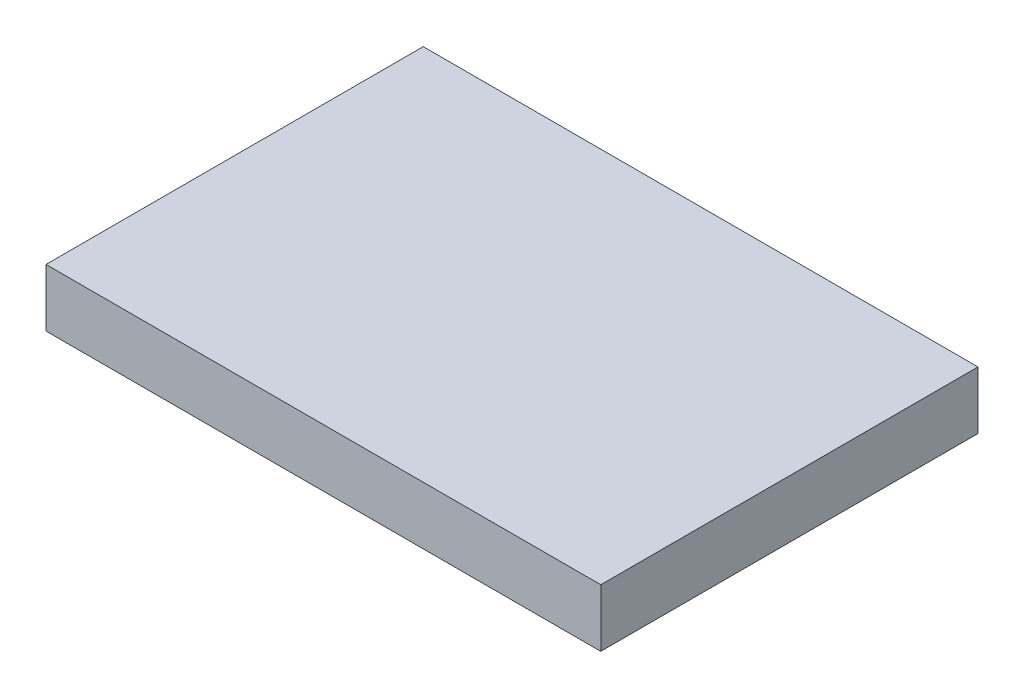
ISO-10303-21;
HEADER;
FILE_DESCRIPTION(('STEP AP214'),'2;1');
FILE_NAME('part.step','',(''),(''),'','','');
FILE_SCHEMA(('AUTOMOTIVE_DESIGN { 1 0 10303 214 1 1 1 1 }'));
ENDSEC;
DATA;
#1=APPLICATION_CONTEXT('core data for automotive mechanical design processes');
#2=APPLICATION_PROTOCOL_DEFINITION('international standard','automotive_design',2000,#1);
#3=PRODUCT_CONTEXT('',#1,'mechanical');
#4=PRODUCT('Part','Part','',(#3));
#5=PRODUCT_RELATED_PRODUCT_CATEGORY('part','',(#4));
#6=PRODUCT_DEFINITION_FORMATION('','',#4);
#7=PRODUCT_DEFINITION_CONTEXT('part definition',#1,'design');
#8=PRODUCT_DEFINITION('design','',#6,#7);
#9=PRODUCT_DEFINITION_SHAPE('','',#8);
#10=(LENGTH_UNIT() NAMED_UNIT(*) SI_UNIT(.MILLI.,.METRE.));
#11=(NAMED_UNIT(*) PLANE_ANGLE_UNIT() SI_UNIT($,.RADIAN.));
#12=(NAMED_UNIT(*) SI_UNIT($,.STERADIAN.) SOLID_ANGLE_UNIT());
#13=UNCERTAINTY_MEASURE_WITH_UNIT(LENGTH_MEASURE(1.E-05),#10,'distance_accuracy_value','');
#14=(GEOMETRIC_REPRESENTATION_CONTEXT(3) GLOBAL_UNCERTAINTY_ASSIGNED_CONTEXT((#13)) GLOBAL_UNIT_ASSIGNED_CONTEXT((#10,
#11,#12)) REPRESENTATION_CONTEXT('',''));
#15=CARTESIAN_POINT('',(0.,0.,0.));
#16=DIRECTION('',(0.,0.,1.));
#17=DIRECTION('',(1.,0.,0.));
#18=AXIS2_PLACEMENT_3D('',#15,#16,#17);
#19=CARTESIAN_POINT('',(25.,5.2,17.));
#20=DIRECTION('',(-1.,0.,0.));
#21=DIRECTION('',(0.,0.,1.));
#22=AXIS2_PLACEMENT_3D('',#19,#20,#21);
#23=PLANE('',#22);
#24=DIRECTION('',(0.,0.,-1.));
#25=VECTOR('',#24,1.);
#26=CARTESIAN_POINT('',(25.,0.,17.));
#27=LINE('',#26,#25);
#28=CARTESIAN_POINT('',(25.,0.,17.));
#29=VERTEX_POINT('',#28);
#30=CARTESIAN_POINT('',(25.,0.,-17.));
#31=VERTEX_POINT('',#30);
#32=EDGE_CURVE('E97',#29,#31,#27,.T.);
#33=ORIENTED_EDGE('',*,*,#32,.T.);
#34=DIRECTION('',(0.,-1.,0.));
#35=VECTOR('',#34,1.);
#36=CARTESIAN_POINT('',(25.,5.2,-17.));
#37=LINE('',#36,#35);
#38=CARTESIAN_POINT('',(25.,5.2,-17.));
#39=VERTEX_POINT('',#38);
#40=EDGE_CURVE('E11',#39,#31,#37,.T.);
#41=ORIENTED_EDGE('',*,*,#40,.F.);
#42=DIRECTION('',(0.,0.,-1.));
#43=VECTOR('',#42,1.);
#44=CARTESIAN_POINT('',(25.,5.2,17.));
#45=LINE('',#44,#43);
#46=CARTESIAN_POINT('',(25.,5.2,17.));
#47=VERTEX_POINT('',#46);
#48=EDGE_CURVE('E85',#47,#39,#45,.T.);
#49=ORIENTED_EDGE('',*,*,#48,.F.);
#50=DIRECTION('',(0.,-1.,0.));
#51=VECTOR('',#50,1.);
#52=CARTESIAN_POINT('',(25.,5.2,17.));
#53=LINE('',#52,#51);
#54=EDGE_CURVE('E93',#47,#29,#53,.T.);
#55=ORIENTED_EDGE('',*,*,#54,.T.);
#56=EDGE_LOOP('',(#33,#41,#49,#55));
#57=FACE_BOUND('',#56,.T.);
#58=ADVANCED_FACE('F34',(#57),#23,.F.);
#59=CARTESIAN_POINT('',(-25.,5.2,-17.));
#60=DIRECTION('',(0.,0.,1.));
#61=DIRECTION('',(1.,0.,0.));
#62=AXIS2_PLACEMENT_3D('',#59,#60,#61);
#63=PLANE('',#62);
#64=DIRECTION('',(-1.,0.,0.));
#65=VECTOR('',#64,1.);
#66=CARTESIAN_POINT('',(-25.,0.,-17.));
#67=LINE('',#66,#65);
#68=CARTESIAN_POINT('',(-25.,0.,-17.));
#69=VERTEX_POINT('',#68);
#70=EDGE_CURVE('E89',#31,#69,#67,.T.);
#71=ORIENTED_EDGE('',*,*,#70,.T.);
#72=DIRECTION('',(0.,-1.,0.));
#73=VECTOR('',#72,1.);
#74=CARTESIAN_POINT('',(-25.,5.2,-17.));
#75=LINE('',#74,#73);
#76=CARTESIAN_POINT('',(-25.,5.2,-17.));
#77=VERTEX_POINT('',#76);
#78=EDGE_CURVE('E42',#77,#69,#75,.T.);
#79=ORIENTED_EDGE('',*,*,#78,.F.);
#80=DIRECTION('',(-1.,0.,0.));
#81=VECTOR('',#80,1.);
#82=CARTESIAN_POINT('',(-25.,5.2,-17.));
#83=LINE('',#82,#81);
#84=EDGE_CURVE('E80',#39,#77,#83,.T.);
#85=ORIENTED_EDGE('',*,*,#84,.F.);
#86=ORIENTED_EDGE('',*,*,#40,.T.);
#87=EDGE_LOOP('',(#71,#79,#85,#86));
#88=FACE_BOUND('',#87,.T.);
#89=ADVANCED_FACE('F88',(#88),#63,.F.);
#90=CARTESIAN_POINT('',(-25.,5.2,17.));
#91=DIRECTION('',(1.,0.,0.));
#92=DIRECTION('',(0.,0.,-1.));
#93=AXIS2_PLACEMENT_3D('',#90,#91,#92);
#94=PLANE('',#93);
#95=DIRECTION('',(0.,0.,1.));
#96=VECTOR('',#95,1.);
#97=CARTESIAN_POINT('',(-25.,0.,17.));
#98=LINE('',#97,#96);
#99=CARTESIAN_POINT('',(-25.,0.,17.));
#100=VERTEX_POINT('',#99);
#101=EDGE_CURVE('E67',#69,#100,#98,.T.);
#102=ORIENTED_EDGE('',*,*,#101,.T.);
#103=DIRECTION('',(0.,-1.,0.));
#104=VECTOR('',#103,1.);
#105=CARTESIAN_POINT('',(-25.,5.2,17.));
#106=LINE('',#105,#104);
#107=CARTESIAN_POINT('',(-25.,5.2,17.));
#108=VERTEX_POINT('',#107);
#109=EDGE_CURVE('E90',#108,#100,#106,.T.);
#110=ORIENTED_EDGE('',*,*,#109,.F.);
#111=DIRECTION('',(0.,0.,1.));
#112=VECTOR('',#111,1.);
#113=CARTESIAN_POINT('',(-25.,5.2,17.));
#114=LINE('',#113,#112);
#115=EDGE_CURVE('E83',#77,#108,#114,.T.);
#116=ORIENTED_EDGE('',*,*,#115,.F.);
#117=ORIENTED_EDGE('',*,*,#78,.T.);
#118=EDGE_LOOP('',(#102,#110,#116,#117));
#119=FACE_BOUND('',#118,.T.);
#120=ADVANCED_FACE('F91',(#119),#94,.F.);
#121=CARTESIAN_POINT('',(-25.,5.2,17.));
#122=DIRECTION('',(0.,0.,-1.));
#123=DIRECTION('',(-1.,0.,0.));
#124=AXIS2_PLACEMENT_3D('',#121,#122,#123);
#125=PLANE('',#124);
#126=DIRECTION('',(1.,0.,0.));
#127=VECTOR('',#126,1.);
#128=CARTESIAN_POINT('',(-25.,0.,17.));
#129=LINE('',#128,#127);
#130=EDGE_CURVE('E73',#100,#29,#129,.T.);
#131=ORIENTED_EDGE('',*,*,#130,.T.);
#132=ORIENTED_EDGE('',*,*,#54,.F.);
#133=DIRECTION('',(1.,0.,0.));
#134=VECTOR('',#133,1.);
#135=CARTESIAN_POINT('',(-25.,5.2,17.));
#136=LINE('',#135,#134);
#137=EDGE_CURVE('E50',#108,#47,#136,.T.);
#138=ORIENTED_EDGE('',*,*,#137,.F.);
#139=ORIENTED_EDGE('',*,*,#109,.T.);
#140=EDGE_LOOP('',(#131,#132,#138,#139));
#141=FACE_BOUND('',#140,.T.);
#142=ADVANCED_FACE('F104',(#141),#125,.F.);
#143=CARTESIAN_POINT('',(0.,5.2,0.));
#144=DIRECTION('',(0.,-1.,0.));
#145=DIRECTION('',(0.,0.,-1.));
#146=AXIS2_PLACEMENT_3D('',#143,#144,#145);
#147=PLANE('',#146);
#148=ORIENTED_EDGE('',*,*,#48,.T.);
#149=ORIENTED_EDGE('',*,*,#84,.T.);
#150=ORIENTED_EDGE('',*,*,#115,.T.);
#151=ORIENTED_EDGE('',*,*,#137,.T.);
#152=EDGE_LOOP('',(#148,#149,#150,#151));
#153=FACE_BOUND('',#152,.T.);
#154=ADVANCED_FACE('F81',(#153),#147,.F.);
#155=CARTESIAN_POINT('',(0.,0.,0.));
#156=DIRECTION('',(0.,-1.,0.));
#157=DIRECTION('',(0.,0.,-1.));
#158=AXIS2_PLACEMENT_3D('',#155,#156,#157);
#159=PLANE('',#158);
#160=ORIENTED_EDGE('',*,*,#32,.F.);
#161=ORIENTED_EDGE('',*,*,#130,.F.);
#162=ORIENTED_EDGE('',*,*,#101,.F.);
#163=ORIENTED_EDGE('',*,*,#70,.F.);
#164=EDGE_LOOP('',(#160,#161,#162,#163));
#165=FACE_BOUND('',#164,.T.);
#166=ADVANCED_FACE('F107',(#165),#159,.T.);
#167=CLOSED_SHELL('',(#58,#89,#120,#142,#154,#166));
#168=MANIFOLD_SOLID_BREP('B2',#167);
#169=ADVANCED_BREP_SHAPE_REPRESENTATION('',(#18,#168),#14);
#170=SHAPE_DEFINITION_REPRESENTATION(#9,#169);
ENDSEC;
END-ISO-10303-21;
